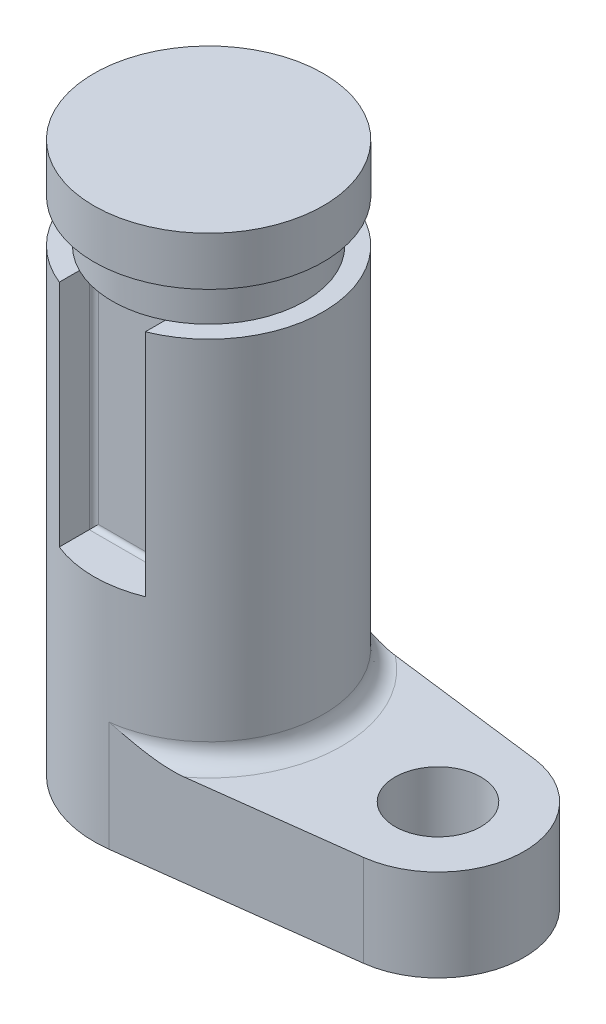
ISO-10303-21;
HEADER;
FILE_DESCRIPTION(('STEP AP214'),'2;1');
FILE_NAME('part.step','',(''),(''),'','','');
FILE_SCHEMA(('AUTOMOTIVE_DESIGN { 1 0 10303 214 1 1 1 1 }'));
ENDSEC;
DATA;
#1=APPLICATION_CONTEXT('core data for automotive mechanical design processes');
#2=APPLICATION_PROTOCOL_DEFINITION('international standard','automotive_design',2000,#1);
#3=PRODUCT_CONTEXT('',#1,'mechanical');
#4=PRODUCT('Part','Part','',(#3));
#5=PRODUCT_RELATED_PRODUCT_CATEGORY('part','',(#4));
#6=PRODUCT_DEFINITION_FORMATION('','',#4);
#7=PRODUCT_DEFINITION_CONTEXT('part definition',#1,'design');
#8=PRODUCT_DEFINITION('design','',#6,#7);
#9=PRODUCT_DEFINITION_SHAPE('','',#8);
#10=(LENGTH_UNIT() NAMED_UNIT(*) SI_UNIT(.MILLI.,.METRE.));
#11=(NAMED_UNIT(*) PLANE_ANGLE_UNIT() SI_UNIT($,.RADIAN.));
#12=(NAMED_UNIT(*) SI_UNIT($,.STERADIAN.) SOLID_ANGLE_UNIT());
#13=UNCERTAINTY_MEASURE_WITH_UNIT(LENGTH_MEASURE(1.E-05),#10,'distance_accuracy_value','');
#14=(GEOMETRIC_REPRESENTATION_CONTEXT(3) GLOBAL_UNCERTAINTY_ASSIGNED_CONTEXT((#13)) GLOBAL_UNIT_ASSIGNED_CONTEXT((#10,
#11,#12)) REPRESENTATION_CONTEXT('',''));
#15=CARTESIAN_POINT('',(0.,0.,0.));
#16=DIRECTION('',(0.,0.,1.));
#17=DIRECTION('',(1.,0.,0.));
#18=AXIS2_PLACEMENT_3D('',#15,#16,#17);
#19=CARTESIAN_POINT('',(0.,12.7,0.));
#20=DIRECTION('',(0.,-1.,0.));
#21=DIRECTION('',(0.,0.,-1.));
#22=AXIS2_PLACEMENT_3D('',#19,#20,#21);
#23=CYLINDRICAL_SURFACE('',#22,3.175);
#24=CARTESIAN_POINT('',(0.,0.508,0.));
#25=DIRECTION('',(0.,-1.,0.));
#26=DIRECTION('',(0.,0.,-1.));
#27=AXIS2_PLACEMENT_3D('',#24,#25,#26);
#28=CIRCLE('',#27,3.175);
#29=CARTESIAN_POINT('',(0.396875,0.508,3.15009765473628));
#30=VERTEX_POINT('',#29);
#31=CARTESIAN_POINT('',(0.396875,0.508,-3.15009765473628));
#32=VERTEX_POINT('',#31);
#33=EDGE_CURVE('E196',#30,#32,#28,.F.);
#34=ORIENTED_EDGE('',*,*,#33,.T.);
#35=DIRECTION('',(0.,1.,0.));
#36=VECTOR('',#35,1.);
#37=CARTESIAN_POINT('',(0.396875,-2.54,-3.15009765473628));
#38=LINE('',#37,#36);
#39=CARTESIAN_POINT('',(0.396875,-2.54,-3.15009765473628));
#40=VERTEX_POINT('',#39);
#41=EDGE_CURVE('E175',#40,#32,#38,.T.);
#42=ORIENTED_EDGE('',*,*,#41,.F.);
#43=CARTESIAN_POINT('',(0.,-2.54,0.));
#44=DIRECTION('',(0.,-1.,0.));
#45=DIRECTION('',(0.,0.,-1.));
#46=AXIS2_PLACEMENT_3D('',#43,#44,#45);
#47=CIRCLE('',#46,3.175);
#48=CARTESIAN_POINT('',(0.396875,-2.54,3.15009765473628));
#49=VERTEX_POINT('',#48);
#50=EDGE_CURVE('E173',#49,#40,#47,.T.);
#51=ORIENTED_EDGE('',*,*,#50,.F.);
#52=DIRECTION('',(0.,1.,0.));
#53=VECTOR('',#52,1.);
#54=CARTESIAN_POINT('',(0.396875,-2.54,3.15009765473628));
#55=LINE('',#54,#53);
#56=EDGE_CURVE('E186',#49,#30,#55,.T.);
#57=ORIENTED_EDGE('',*,*,#56,.T.);
#58=EDGE_LOOP('',(#34,#42,#51,#57));
#59=FACE_BOUND('',#58,.T.);
#60=CARTESIAN_POINT('',(0.,10.16,0.));
#61=DIRECTION('',(0.,1.,0.));
#62=DIRECTION('',(0.,0.,1.));
#63=AXIS2_PLACEMENT_3D('',#60,#61,#62);
#64=CIRCLE('',#63,3.175);
#65=CARTESIAN_POINT('',(1.190625,10.16,2.94330377456609));
#66=VERTEX_POINT('',#65);
#67=CARTESIAN_POINT('',(-1.190625,10.16,2.94330377456609));
#68=VERTEX_POINT('',#67);
#69=EDGE_CURVE('E153',#66,#68,#64,.T.);
#70=ORIENTED_EDGE('',*,*,#69,.F.);
#71=DIRECTION('',(0.,-1.,0.));
#72=VECTOR('',#71,1.);
#73=CARTESIAN_POINT('',(1.190625,12.7,2.94330377456609));
#74=LINE('',#73,#72);
#75=CARTESIAN_POINT('',(1.190625,3.81,2.94330377456609));
#76=VERTEX_POINT('',#75);
#77=EDGE_CURVE('E149',#76,#66,#74,.F.);
#78=ORIENTED_EDGE('',*,*,#77,.F.);
#79=CARTESIAN_POINT('',(0.,3.81,0.));
#80=DIRECTION('',(0.,-1.,0.));
#81=DIRECTION('',(0.,0.,-1.));
#82=AXIS2_PLACEMENT_3D('',#79,#80,#81);
#83=CIRCLE('',#82,3.175);
#84=CARTESIAN_POINT('',(-1.190625,3.81,2.94330377456609));
#85=VERTEX_POINT('',#84);
#86=EDGE_CURVE('E327',#76,#85,#83,.T.);
#87=ORIENTED_EDGE('',*,*,#86,.T.);
#88=DIRECTION('',(0.,-1.,0.));
#89=VECTOR('',#88,1.);
#90=CARTESIAN_POINT('',(-1.190625,12.7,2.94330377456609));
#91=LINE('',#90,#89);
#92=EDGE_CURVE('E329',#68,#85,#91,.T.);
#93=ORIENTED_EDGE('',*,*,#92,.F.);
#94=EDGE_LOOP('',(#70,#78,#87,#93));
#95=FACE_BOUND('',#94,.T.);
#96=ADVANCED_FACE('F38',(#59,#95),#23,.T.);
#97=CARTESIAN_POINT('',(0.,10.16,0.));
#98=DIRECTION('',(0.,-1.,0.));
#99=DIRECTION('',(0.,0.,-1.));
#100=AXIS2_PLACEMENT_3D('',#97,#98,#99);
#101=PLANE('',#100);
#102=CARTESIAN_POINT('',(0.,10.16,0.));
#103=DIRECTION('',(0.,-1.,0.));
#104=DIRECTION('',(0.,0.,-1.));
#105=AXIS2_PLACEMENT_3D('',#102,#103,#104);
#106=CIRCLE('',#105,2.667);
#107=CARTESIAN_POINT('',(-1.190625,10.16,2.38648300001802));
#108=VERTEX_POINT('',#107);
#109=CARTESIAN_POINT('',(1.190625,10.16,2.38648300001802));
#110=VERTEX_POINT('',#109);
#111=EDGE_CURVE('E12',#108,#110,#106,.F.);
#112=ORIENTED_EDGE('',*,*,#111,.F.);
#113=DIRECTION('',(0.,0.,1.));
#114=VECTOR('',#113,1.);
#115=CARTESIAN_POINT('',(-1.190625,10.16,4.36372));
#116=LINE('',#115,#114);
#117=CARTESIAN_POINT('',(-1.190625,10.16,2.11328));
#118=VERTEX_POINT('',#117);
#119=EDGE_CURVE('E150',#118,#108,#116,.T.);
#120=ORIENTED_EDGE('',*,*,#119,.F.);
#121=DIRECTION('',(-1.,0.,0.));
#122=VECTOR('',#121,1.);
#123=CARTESIAN_POINT('',(1.190625,10.16,2.11328));
#124=LINE('',#123,#122);
#125=CARTESIAN_POINT('',(1.190625,10.16,2.11328));
#126=VERTEX_POINT('',#125);
#127=EDGE_CURVE('E47',#118,#126,#124,.F.);
#128=ORIENTED_EDGE('',*,*,#127,.T.);
#129=DIRECTION('',(0.,0.,-1.));
#130=VECTOR('',#129,1.);
#131=CARTESIAN_POINT('',(1.190625,10.16,4.36372));
#132=LINE('',#131,#130);
#133=EDGE_CURVE('E141',#110,#126,#132,.T.);
#134=ORIENTED_EDGE('',*,*,#133,.F.);
#135=EDGE_LOOP('',(#112,#120,#128,#134));
#136=FACE_BOUND('',#135,.T.);
#137=ADVANCED_FACE('F142',(#136),#101,.T.);
#138=CARTESIAN_POINT('',(0.396875,-2.54,-3.15009765473628));
#139=DIRECTION('',(0.125,0.,-0.992156741649221));
#140=DIRECTION('',(-0.992156741649222,0.,-0.125));
#141=AXIS2_PLACEMENT_3D('',#138,#139,#140);
#142=PLANE('',#141);
#143=DIRECTION('',(-0.992156741649222,0.,-0.125));
#144=VECTOR('',#143,1.);
#145=CARTESIAN_POINT('',(0.396875,0.,-3.15009765473628));
#146=LINE('',#145,#144);
#147=CARTESIAN_POINT('',(6.64765625,0.,-2.36257324105221));
#148=VERTEX_POINT('',#147);
#149=CARTESIAN_POINT('',(2.24874665457004,0.,-2.91678375673618));
#150=VERTEX_POINT('',#149);
#151=EDGE_CURVE('E178',#148,#150,#146,.T.);
#152=ORIENTED_EDGE('',*,*,#151,.F.);
#153=DIRECTION('',(0.,1.,0.));
#154=VECTOR('',#153,1.);
#155=CARTESIAN_POINT('',(6.64765625,-2.54,-2.36257324105221));
#156=LINE('',#155,#154);
#157=CARTESIAN_POINT('',(6.64765625,-2.54,-2.36257324105221));
#158=VERTEX_POINT('',#157);
#159=EDGE_CURVE('E191',#158,#148,#156,.T.);
#160=ORIENTED_EDGE('',*,*,#159,.F.);
#161=DIRECTION('',(-0.992156741649222,0.,-0.125));
#162=VECTOR('',#161,1.);
#163=CARTESIAN_POINT('',(0.396875,-2.54,-3.15009765473628));
#164=LINE('',#163,#162);
#165=EDGE_CURVE('E163',#158,#40,#164,.T.);
#166=ORIENTED_EDGE('',*,*,#165,.T.);
#167=ORIENTED_EDGE('',*,*,#41,.T.);
#168=CARTESIAN_POINT('',(2.24874665457004,0.,-2.91678375673618));
#169=CARTESIAN_POINT('',(2.21231549692085,5.71728721498376E-06,-2.92137365117018));
#170=CARTESIAN_POINT('',(2.1758992098971,0.0010217288468089,-2.92596167208147));
#171=CARTESIAN_POINT('',(2.10317961007519,0.0048511736851646,-2.93512348048952));
#172=CARTESIAN_POINT('',(2.0668762431913,0.00766354336836755,-2.93969727480043));
#173=CARTESIAN_POINT('',(1.95839957562027,0.0184425634130269,-2.95336405029785));
#174=CARTESIAN_POINT('',(1.88645399557374,0.0287536847308182,-2.9624283413804));
#175=CARTESIAN_POINT('',(1.74411958427554,0.0541431163065835,-2.98036079163287));
#176=CARTESIAN_POINT('',(1.67372251439235,0.0691765666242499,-2.9892299887728));
#177=CARTESIAN_POINT('',(1.53378182393322,0.103023101549795,-3.00686085854677));
#178=CARTESIAN_POINT('',(1.46423892542614,0.121839177901396,-3.01562244020869));
#179=CARTESIAN_POINT('',(1.22704733837716,0.191369163494818,-3.04550577127576));
#180=CARTESIAN_POINT('',(1.06148442447233,0.249183267367251,-3.06636473777706));
#181=CARTESIAN_POINT('',(0.733022295383638,0.37256608848623,-3.10774707628523));
#182=CARTESIAN_POINT('',(0.570129927965552,0.438151996715697,-3.1282695855547));
#183=CARTESIAN_POINT('',(0.403795894832265,0.505209760541778,-3.14922570394693));
#184=CARTESIAN_POINT('',(0.400335450392073,0.506604880917865,-3.14966167896667));
#185=CARTESIAN_POINT('',(0.396875,0.508,-3.15009765473628));
#186=B_SPLINE_CURVE_WITH_KNOTS('',3,(#168,#169,#170,#171,#172,#173,#174,#175,#176,#177,#178,
#179,#180,#181,#182,#183,#184,#185),.UNSPECIFIED.,.F.,.F.,(4,2,2,2,2,2,2,2,4),(0.,
0.11012057214495,0.220176003983427,0.439667149666648,0.657133261980577,0.874772053488899,
1.40399836213705,1.93441795718018,1.94568738488306),.UNSPECIFIED.);
#187=EDGE_CURVE('E201',#32,#150,#186,.F.);
#188=ORIENTED_EDGE('',*,*,#187,.T.);
#189=EDGE_LOOP('',(#152,#160,#166,#167,#188));
#190=FACE_BOUND('',#189,.T.);
#191=ADVANCED_FACE('F214',(#190),#142,.T.);
#192=CARTESIAN_POINT('',(6.35,-2.54,0.));
#193=DIRECTION('',(0.,1.,0.));
#194=DIRECTION('',(0.,0.,1.));
#195=AXIS2_PLACEMENT_3D('',#192,#193,#194);
#196=CYLINDRICAL_SURFACE('',#195,2.38125);
#197=CARTESIAN_POINT('',(6.35,0.,0.));
#198=DIRECTION('',(0.,-1.,0.));
#199=DIRECTION('',(0.,0.,-1.));
#200=AXIS2_PLACEMENT_3D('',#197,#198,#199);
#201=CIRCLE('',#200,2.38125);
#202=CARTESIAN_POINT('',(6.64765625,0.,2.36257324105221));
#203=VERTEX_POINT('',#202);
#204=EDGE_CURVE('E181',#203,#148,#201,.F.);
#205=ORIENTED_EDGE('',*,*,#204,.F.);
#206=DIRECTION('',(0.,1.,0.));
#207=VECTOR('',#206,1.);
#208=CARTESIAN_POINT('',(6.64765625,-2.54,2.36257324105221));
#209=LINE('',#208,#207);
#210=CARTESIAN_POINT('',(6.64765625,-2.54,2.36257324105221));
#211=VERTEX_POINT('',#210);
#212=EDGE_CURVE('E188',#211,#203,#209,.T.);
#213=ORIENTED_EDGE('',*,*,#212,.F.);
#214=CARTESIAN_POINT('',(6.35,-2.54,0.));
#215=DIRECTION('',(0.,-1.,0.));
#216=DIRECTION('',(0.,0.,-1.));
#217=AXIS2_PLACEMENT_3D('',#214,#215,#216);
#218=CIRCLE('',#217,2.38125);
#219=EDGE_CURVE('E167',#211,#158,#218,.F.);
#220=ORIENTED_EDGE('',*,*,#219,.T.);
#221=ORIENTED_EDGE('',*,*,#159,.T.);
#222=EDGE_LOOP('',(#205,#213,#220,#221));
#223=FACE_BOUND('',#222,.T.);
#224=ADVANCED_FACE('F304',(#223),#196,.T.);
#225=CARTESIAN_POINT('',(0.396875,-2.54,3.15009765473628));
#226=DIRECTION('',(0.125,0.,0.992156741649221));
#227=DIRECTION('',(0.992156741649222,0.,-0.125));
#228=AXIS2_PLACEMENT_3D('',#225,#226,#227);
#229=PLANE('',#228);
#230=DIRECTION('',(0.992156741649222,0.,-0.125));
#231=VECTOR('',#230,1.);
#232=CARTESIAN_POINT('',(0.396875,0.,3.15009765473628));
#233=LINE('',#232,#231);
#234=CARTESIAN_POINT('',(2.24874665457004,0.,2.91678375673618));
#235=VERTEX_POINT('',#234);
#236=EDGE_CURVE('E164',#235,#203,#233,.T.);
#237=ORIENTED_EDGE('',*,*,#236,.F.);
#238=CARTESIAN_POINT('',(2.24874665457004,0.,2.91678375673618));
#239=CARTESIAN_POINT('',(2.21231549692085,5.71728721472642E-06,2.92137365117018));
#240=CARTESIAN_POINT('',(2.17589920989711,0.00102172884680827,2.92596167208147));
#241=CARTESIAN_POINT('',(2.10317961007522,0.0048511736851627,2.93512348048951));
#242=CARTESIAN_POINT('',(2.06687624319133,0.00766354336836473,2.93969727480042));
#243=CARTESIAN_POINT('',(1.95839957562032,0.0184425634130203,2.95336405029785));
#244=CARTESIAN_POINT('',(1.88645399557381,0.0287536847308077,2.96242834138039));
#245=CARTESIAN_POINT('',(1.7441195842756,0.0541431163065709,2.98036079163286));
#246=CARTESIAN_POINT('',(1.6737225143924,0.0691765666242408,2.98922998877279));
#247=CARTESIAN_POINT('',(1.53378182393324,0.103023101549786,3.00686085854677));
#248=CARTESIAN_POINT('',(1.46423892542614,0.121839177901384,3.01562244020869));
#249=CARTESIAN_POINT('',(1.22704733837716,0.19136916349484,3.04550577127576));
#250=CARTESIAN_POINT('',(1.06148442447237,0.24918326736738,3.06636473777706));
#251=CARTESIAN_POINT('',(0.733022295383581,0.372566088486109,3.10774707628524));
#252=CARTESIAN_POINT('',(0.57012992796536,0.43815199671522,3.12826958555472));
#253=CARTESIAN_POINT('',(0.403795894832259,0.505209760541757,3.14922570394694));
#254=CARTESIAN_POINT('',(0.40033545039207,0.506604880917854,3.14966167896667));
#255=CARTESIAN_POINT('',(0.396875,0.508,3.15009765473628));
#256=B_SPLINE_CURVE_WITH_KNOTS('',3,(#238,#239,#240,#241,#242,#243,#244,#245,#246,#247,#248,
#249,#250,#251,#252,#253,#254,#255),.UNSPECIFIED.,.F.,.F.,(4,2,2,2,2,2,2,2,4),(0.,
0.110120572144929,0.220176003983383,0.439667149666569,0.657133261980542,0.874772053488902,
1.40399836213706,1.93441795718018,1.94568738488306),.UNSPECIFIED.);
#257=EDGE_CURVE('E208',#235,#30,#256,.T.);
#258=ORIENTED_EDGE('',*,*,#257,.T.);
#259=ORIENTED_EDGE('',*,*,#56,.F.);
#260=DIRECTION('',(0.992156741649222,0.,-0.125));
#261=VECTOR('',#260,1.);
#262=CARTESIAN_POINT('',(0.396875,-2.54,3.15009765473628));
#263=LINE('',#262,#261);
#264=EDGE_CURVE('E170',#49,#211,#263,.T.);
#265=ORIENTED_EDGE('',*,*,#264,.T.);
#266=ORIENTED_EDGE('',*,*,#212,.T.);
#267=EDGE_LOOP('',(#237,#258,#259,#265,#266));
#268=FACE_BOUND('',#267,.T.);
#269=ADVANCED_FACE('F301',(#268),#229,.T.);
#270=CARTESIAN_POINT('',(6.35,-2.54,0.));
#271=DIRECTION('',(0.,1.,0.));
#272=DIRECTION('',(0.,0.,1.));
#273=AXIS2_PLACEMENT_3D('',#270,#271,#272);
#274=CYLINDRICAL_SURFACE('',#273,1.190625);
#275=CARTESIAN_POINT('',(6.35,-2.54,0.));
#276=DIRECTION('',(0.,-1.,0.));
#277=DIRECTION('',(0.,0.,-1.));
#278=AXIS2_PLACEMENT_3D('',#275,#276,#277);
#279=CIRCLE('',#278,1.190625);
#280=CARTESIAN_POINT('',(6.35,-2.54,-1.190625));
#281=VERTEX_POINT('',#280);
#282=EDGE_CURVE('E160',#281,#281,#279,.T.);
#283=ORIENTED_EDGE('',*,*,#282,.T.);
#284=EDGE_LOOP('',(#283));
#285=FACE_BOUND('',#284,.T.);
#286=CARTESIAN_POINT('',(6.35,0.,0.));
#287=DIRECTION('',(0.,-1.,0.));
#288=DIRECTION('',(0.,0.,-1.));
#289=AXIS2_PLACEMENT_3D('',#286,#287,#288);
#290=CIRCLE('',#289,1.190625);
#291=CARTESIAN_POINT('',(6.35,0.,-1.190625));
#292=VERTEX_POINT('',#291);
#293=EDGE_CURVE('E155',#292,#292,#290,.T.);
#294=ORIENTED_EDGE('',*,*,#293,.F.);
#295=EDGE_LOOP('',(#294));
#296=FACE_BOUND('',#295,.T.);
#297=ADVANCED_FACE('F297',(#285,#296),#274,.F.);
#298=CARTESIAN_POINT('',(0.,-2.54,0.));
#299=DIRECTION('',(0.,-1.,0.));
#300=DIRECTION('',(0.,0.,-1.));
#301=AXIS2_PLACEMENT_3D('',#298,#299,#300);
#302=PLANE('',#301);
#303=ORIENTED_EDGE('',*,*,#282,.F.);
#304=EDGE_LOOP('',(#303));
#305=FACE_BOUND('',#304,.T.);
#306=ORIENTED_EDGE('',*,*,#165,.F.);
#307=ORIENTED_EDGE('',*,*,#219,.F.);
#308=ORIENTED_EDGE('',*,*,#264,.F.);
#309=ORIENTED_EDGE('',*,*,#50,.T.);
#310=EDGE_LOOP('',(#306,#307,#308,#309));
#311=FACE_BOUND('',#310,.T.);
#312=ADVANCED_FACE('F294',(#305,#311),#302,.T.);
#313=CARTESIAN_POINT('',(0.,0.,0.));
#314=DIRECTION('',(0.,-1.,0.));
#315=DIRECTION('',(0.,0.,-1.));
#316=AXIS2_PLACEMENT_3D('',#313,#314,#315);
#317=PLANE('',#316);
#318=ORIENTED_EDGE('',*,*,#151,.T.);
#319=CARTESIAN_POINT('',(0.,0.,0.));
#320=DIRECTION('',(0.,-1.,0.));
#321=DIRECTION('',(0.,0.,-1.));
#322=AXIS2_PLACEMENT_3D('',#319,#320,#321);
#323=CIRCLE('',#322,3.683);
#324=EDGE_CURVE('E199',#150,#235,#323,.T.);
#325=ORIENTED_EDGE('',*,*,#324,.T.);
#326=ORIENTED_EDGE('',*,*,#236,.T.);
#327=ORIENTED_EDGE('',*,*,#204,.T.);
#328=EDGE_LOOP('',(#318,#325,#326,#327));
#329=FACE_BOUND('',#328,.T.);
#330=ORIENTED_EDGE('',*,*,#293,.T.);
#331=EDGE_LOOP('',(#330));
#332=FACE_BOUND('',#331,.T.);
#333=ADVANCED_FACE('F223',(#329,#332),#317,.F.);
#334=CARTESIAN_POINT('',(0.,0.508,0.));
#335=DIRECTION('',(0.,-1.,0.));
#336=DIRECTION('',(0.,0.,-1.));
#337=AXIS2_PLACEMENT_3D('',#334,#335,#336);
#338=TOROIDAL_SURFACE('',#337,3.683,0.508);
#339=ORIENTED_EDGE('',*,*,#257,.F.);
#340=ORIENTED_EDGE('',*,*,#324,.F.);
#341=ORIENTED_EDGE('',*,*,#187,.F.);
#342=ORIENTED_EDGE('',*,*,#33,.F.);
#343=EDGE_LOOP('',(#339,#340,#341,#342));
#344=FACE_BOUND('',#343,.T.);
#345=ADVANCED_FACE('F218',(#344),#338,.F.);
#346=CARTESIAN_POINT('',(1.190625,10.16,4.36372));
#347=DIRECTION('',(-1.,0.,0.));
#348=DIRECTION('',(0.,0.,1.));
#349=AXIS2_PLACEMENT_3D('',#346,#347,#348);
#350=PLANE('',#349);
#351=EDGE_CURVE('E134',#66,#110,#132,.T.);
#352=ORIENTED_EDGE('',*,*,#351,.T.);
#353=ORIENTED_EDGE('',*,*,#133,.T.);
#354=DIRECTION('',(0.,-1.,0.));
#355=VECTOR('',#354,1.);
#356=CARTESIAN_POINT('',(1.190625,3.81,2.11328));
#357=LINE('',#356,#355);
#358=CARTESIAN_POINT('',(1.190625,3.81,2.11328));
#359=VERTEX_POINT('',#358);
#360=EDGE_CURVE('E60',#126,#359,#357,.T.);
#361=ORIENTED_EDGE('',*,*,#360,.T.);
#362=DIRECTION('',(0.,0.,-1.));
#363=VECTOR('',#362,1.);
#364=CARTESIAN_POINT('',(1.190625,3.81,4.36372));
#365=LINE('',#364,#363);
#366=EDGE_CURVE('E156',#76,#359,#365,.T.);
#367=ORIENTED_EDGE('',*,*,#366,.F.);
#368=ORIENTED_EDGE('',*,*,#77,.T.);
#369=EDGE_LOOP('',(#352,#353,#361,#367,#368));
#370=FACE_BOUND('',#369,.T.);
#371=ADVANCED_FACE('F147',(#370),#350,.T.);
#372=CARTESIAN_POINT('',(-1.190625,10.16,4.36372));
#373=DIRECTION('',(1.,0.,0.));
#374=DIRECTION('',(0.,0.,-1.));
#375=AXIS2_PLACEMENT_3D('',#372,#373,#374);
#376=PLANE('',#375);
#377=DIRECTION('',(0.,0.,1.));
#378=VECTOR('',#377,1.);
#379=CARTESIAN_POINT('',(-1.190625,3.81,4.36372));
#380=LINE('',#379,#378);
#381=CARTESIAN_POINT('',(-1.190625,3.81,2.11328));
#382=VERTEX_POINT('',#381);
#383=EDGE_CURVE('E144',#382,#85,#380,.T.);
#384=ORIENTED_EDGE('',*,*,#383,.F.);
#385=DIRECTION('',(0.,-1.,0.));
#386=VECTOR('',#385,1.);
#387=CARTESIAN_POINT('',(-1.190625,10.16,2.11328));
#388=LINE('',#387,#386);
#389=EDGE_CURVE('E344',#382,#118,#388,.F.);
#390=ORIENTED_EDGE('',*,*,#389,.T.);
#391=ORIENTED_EDGE('',*,*,#119,.T.);
#392=EDGE_CURVE('E137',#108,#68,#116,.T.);
#393=ORIENTED_EDGE('',*,*,#392,.T.);
#394=ORIENTED_EDGE('',*,*,#92,.T.);
#395=EDGE_LOOP('',(#384,#390,#391,#393,#394));
#396=FACE_BOUND('',#395,.T.);
#397=ADVANCED_FACE('F284',(#396),#376,.T.);
#398=CARTESIAN_POINT('',(0.,3.81,0.));
#399=DIRECTION('',(0.,-1.,0.));
#400=DIRECTION('',(0.,0.,-1.));
#401=AXIS2_PLACEMENT_3D('',#398,#399,#400);
#402=PLANE('',#401);
#403=ORIENTED_EDGE('',*,*,#366,.T.);
#404=DIRECTION('',(-1.,0.,0.));
#405=VECTOR('',#404,1.);
#406=CARTESIAN_POINT('',(0.,3.81,2.11328));
#407=LINE('',#406,#405);
#408=EDGE_CURVE('E348',#359,#382,#407,.T.);
#409=ORIENTED_EDGE('',*,*,#408,.T.);
#410=ORIENTED_EDGE('',*,*,#383,.T.);
#411=ORIENTED_EDGE('',*,*,#86,.F.);
#412=EDGE_LOOP('',(#403,#409,#410,#411));
#413=FACE_BOUND('',#412,.T.);
#414=ADVANCED_FACE('F281',(#413),#402,.F.);
#415=CARTESIAN_POINT('',(-1.190625,10.16,1.98628));
#416=DIRECTION('',(0.,0.,1.));
#417=DIRECTION('',(1.,0.,0.));
#418=AXIS2_PLACEMENT_3D('',#415,#416,#417);
#419=PLANE('',#418);
#420=DIRECTION('',(0.,-1.,0.));
#421=VECTOR('',#420,1.);
#422=CARTESIAN_POINT('',(-1.063625,3.81,1.98628));
#423=LINE('',#422,#421);
#424=CARTESIAN_POINT('',(-1.063625,10.033,1.98628));
#425=VERTEX_POINT('',#424);
#426=CARTESIAN_POINT('',(-1.063625,3.937,1.98628));
#427=VERTEX_POINT('',#426);
#428=EDGE_CURVE('E339',#425,#427,#423,.T.);
#429=ORIENTED_EDGE('',*,*,#428,.T.);
#430=DIRECTION('',(-1.,0.,0.));
#431=VECTOR('',#430,1.);
#432=CARTESIAN_POINT('',(-1.190625,3.937,1.98628));
#433=LINE('',#432,#431);
#434=CARTESIAN_POINT('',(1.063625,3.937,1.98628));
#435=VERTEX_POINT('',#434);
#436=EDGE_CURVE('E342',#427,#435,#433,.F.);
#437=ORIENTED_EDGE('',*,*,#436,.T.);
#438=DIRECTION('',(0.,-1.,0.));
#439=VECTOR('',#438,1.);
#440=CARTESIAN_POINT('',(1.063625,10.16,1.98628));
#441=LINE('',#440,#439);
#442=CARTESIAN_POINT('',(1.063625,10.033,1.98628));
#443=VERTEX_POINT('',#442);
#444=EDGE_CURVE('E337',#435,#443,#441,.F.);
#445=ORIENTED_EDGE('',*,*,#444,.T.);
#446=DIRECTION('',(-1.,0.,0.));
#447=VECTOR('',#446,1.);
#448=CARTESIAN_POINT('',(-1.190625,10.033,1.98628));
#449=LINE('',#448,#447);
#450=EDGE_CURVE('E335',#443,#425,#449,.T.);
#451=ORIENTED_EDGE('',*,*,#450,.T.);
#452=EDGE_LOOP('',(#429,#437,#445,#451));
#453=FACE_BOUND('',#452,.T.);
#454=ADVANCED_FACE('F242',(#453),#419,.T.);
#455=CARTESIAN_POINT('',(1.063625,10.16,2.11328));
#456=DIRECTION('',(0.,1.,0.));
#457=DIRECTION('',(0.,0.,1.));
#458=AXIS2_PLACEMENT_3D('',#455,#456,#457);
#459=CYLINDRICAL_SURFACE('',#458,0.127);
#460=CARTESIAN_POINT('',(1.063625,3.937,2.11328));
#461=DIRECTION('',(0.707106781186547,0.707106781186547,0.));
#462=DIRECTION('',(-0.707106781186547,0.707106781186547,0.));
#463=AXIS2_PLACEMENT_3D('',#460,#461,#462);
#464=ELLIPSE('',#463,0.179605122421383,0.127);
#465=EDGE_CURVE('E352',#359,#435,#464,.T.);
#466=ORIENTED_EDGE('',*,*,#465,.F.);
#467=ORIENTED_EDGE('',*,*,#360,.F.);
#468=CARTESIAN_POINT('',(1.063625,10.033,2.11328));
#469=DIRECTION('',(-0.707106781186547,0.707106781186547,0.));
#470=DIRECTION('',(0.707106781186547,0.707106781186547,0.));
#471=AXIS2_PLACEMENT_3D('',#468,#469,#470);
#472=ELLIPSE('',#471,0.179605122421383,0.127);
#473=EDGE_CURVE('E158',#443,#126,#472,.F.);
#474=ORIENTED_EDGE('',*,*,#473,.F.);
#475=ORIENTED_EDGE('',*,*,#444,.F.);
#476=EDGE_LOOP('',(#466,#467,#474,#475));
#477=FACE_BOUND('',#476,.T.);
#478=ADVANCED_FACE('F40',(#477),#459,.F.);
#479=CARTESIAN_POINT('',(-1.190625,10.033,2.11328));
#480=DIRECTION('',(1.,0.,0.));
#481=DIRECTION('',(0.,0.,-1.));
#482=AXIS2_PLACEMENT_3D('',#479,#480,#481);
#483=CYLINDRICAL_SURFACE('',#482,0.127);
#484=ORIENTED_EDGE('',*,*,#473,.T.);
#485=ORIENTED_EDGE('',*,*,#127,.F.);
#486=CARTESIAN_POINT('',(-1.063625,10.033,2.11328));
#487=DIRECTION('',(0.707106781186547,0.707106781186547,0.));
#488=DIRECTION('',(-0.707106781186547,0.707106781186547,0.));
#489=AXIS2_PLACEMENT_3D('',#486,#487,#488);
#490=ELLIPSE('',#489,0.179605122421383,0.127);
#491=EDGE_CURVE('E265',#425,#118,#490,.T.);
#492=ORIENTED_EDGE('',*,*,#491,.F.);
#493=ORIENTED_EDGE('',*,*,#450,.F.);
#494=EDGE_LOOP('',(#484,#485,#492,#493));
#495=FACE_BOUND('',#494,.T.);
#496=ADVANCED_FACE('F235',(#495),#483,.F.);
#497=CARTESIAN_POINT('',(0.,3.937,2.11328));
#498=DIRECTION('',(-1.,0.,0.));
#499=DIRECTION('',(0.,0.,1.));
#500=AXIS2_PLACEMENT_3D('',#497,#498,#499);
#501=CYLINDRICAL_SURFACE('',#500,0.127);
#502=ORIENTED_EDGE('',*,*,#465,.T.);
#503=ORIENTED_EDGE('',*,*,#436,.F.);
#504=CARTESIAN_POINT('',(-1.063625,3.937,2.11328));
#505=DIRECTION('',(-0.707106781186547,0.707106781186547,0.));
#506=DIRECTION('',(0.707106781186547,0.707106781186547,0.));
#507=AXIS2_PLACEMENT_3D('',#504,#505,#506);
#508=ELLIPSE('',#507,0.179605122421383,0.127);
#509=EDGE_CURVE('E264',#382,#427,#508,.F.);
#510=ORIENTED_EDGE('',*,*,#509,.F.);
#511=ORIENTED_EDGE('',*,*,#408,.F.);
#512=EDGE_LOOP('',(#502,#503,#510,#511));
#513=FACE_BOUND('',#512,.T.);
#514=ADVANCED_FACE('F232',(#513),#501,.F.);
#515=CARTESIAN_POINT('',(-1.063625,10.16,2.11328));
#516=DIRECTION('',(0.,1.,0.));
#517=DIRECTION('',(0.,0.,1.));
#518=AXIS2_PLACEMENT_3D('',#515,#516,#517);
#519=CYLINDRICAL_SURFACE('',#518,0.127);
#520=ORIENTED_EDGE('',*,*,#491,.T.);
#521=ORIENTED_EDGE('',*,*,#389,.F.);
#522=ORIENTED_EDGE('',*,*,#509,.T.);
#523=ORIENTED_EDGE('',*,*,#428,.F.);
#524=EDGE_LOOP('',(#520,#521,#522,#523));
#525=FACE_BOUND('',#524,.T.);
#526=ADVANCED_FACE('F227',(#525),#519,.F.);
#527=CARTESIAN_POINT('',(2.778125,11.3538,0.));
#528=DIRECTION('',(0.,1.,0.));
#529=DIRECTION('',(0.,0.,1.));
#530=AXIS2_PLACEMENT_3D('',#527,#528,#529);
#531=PLANE('',#530);
#532=CARTESIAN_POINT('',(0.,11.3538,0.));
#533=DIRECTION('',(0.,1.,0.));
#534=DIRECTION('',(0.,0.,1.));
#535=AXIS2_PLACEMENT_3D('',#532,#533,#534);
#536=CIRCLE('',#535,2.667);
#537=CARTESIAN_POINT('',(0.,11.3538,2.667));
#538=VERTEX_POINT('',#537);
#539=EDGE_CURVE('E138',#538,#538,#536,.T.);
#540=ORIENTED_EDGE('',*,*,#539,.T.);
#541=EDGE_LOOP('',(#540));
#542=FACE_BOUND('',#541,.T.);
#543=CARTESIAN_POINT('',(0.,11.3538,0.));
#544=DIRECTION('',(0.,1.,0.));
#545=DIRECTION('',(0.,0.,1.));
#546=AXIS2_PLACEMENT_3D('',#543,#544,#545);
#547=CIRCLE('',#546,3.175);
#548=CARTESIAN_POINT('',(0.,11.3538,3.175));
#549=VERTEX_POINT('',#548);
#550=EDGE_CURVE('E42',#549,#549,#547,.T.);
#551=ORIENTED_EDGE('',*,*,#550,.F.);
#552=EDGE_LOOP('',(#551));
#553=FACE_BOUND('',#552,.T.);
#554=ADVANCED_FACE('F231',(#542,#553),#531,.F.);
#555=CARTESIAN_POINT('',(2.778125,10.16,0.));
#556=DIRECTION('',(0.,1.,0.));
#557=DIRECTION('',(0.,0.,1.));
#558=AXIS2_PLACEMENT_3D('',#555,#556,#557);
#559=PLANE('',#558);
#560=ORIENTED_EDGE('',*,*,#69,.T.);
#561=ORIENTED_EDGE('',*,*,#392,.F.);
#562=CARTESIAN_POINT('',(0.,10.16,0.));
#563=DIRECTION('',(0.,1.,0.));
#564=DIRECTION('',(0.,0.,1.));
#565=AXIS2_PLACEMENT_3D('',#562,#563,#564);
#566=CIRCLE('',#565,2.667);
#567=EDGE_CURVE('E52',#110,#108,#566,.T.);
#568=ORIENTED_EDGE('',*,*,#567,.F.);
#569=ORIENTED_EDGE('',*,*,#351,.F.);
#570=EDGE_LOOP('',(#560,#561,#568,#569));
#571=FACE_BOUND('',#570,.T.);
#572=ADVANCED_FACE('F132',(#571),#559,.T.);
#573=CARTESIAN_POINT('',(0.,11.3538,0.));
#574=DIRECTION('',(0.,-1.,0.));
#575=DIRECTION('',(0.,0.,-1.));
#576=AXIS2_PLACEMENT_3D('',#573,#574,#575);
#577=CYLINDRICAL_SURFACE('',#576,2.667);
#578=ORIENTED_EDGE('',*,*,#539,.F.);
#579=EDGE_LOOP('',(#578));
#580=FACE_BOUND('',#579,.T.);
#581=ORIENTED_EDGE('',*,*,#567,.T.);
#582=ORIENTED_EDGE('',*,*,#111,.T.);
#583=EDGE_LOOP('',(#581,#582));
#584=FACE_BOUND('',#583,.T.);
#585=ADVANCED_FACE('F126',(#580,#584),#577,.T.);
#586=CARTESIAN_POINT('',(0.,12.7,0.));
#587=DIRECTION('',(0.,1.,0.));
#588=DIRECTION('',(0.,0.,1.));
#589=AXIS2_PLACEMENT_3D('',#586,#587,#588);
#590=PLANE('',#589);
#591=CARTESIAN_POINT('',(0.,12.7,0.));
#592=DIRECTION('',(0.,1.,0.));
#593=DIRECTION('',(0.,0.,1.));
#594=AXIS2_PLACEMENT_3D('',#591,#592,#593);
#595=CIRCLE('',#594,3.175);
#596=CARTESIAN_POINT('',(0.,12.7,3.175));
#597=VERTEX_POINT('',#596);
#598=EDGE_CURVE('E193',#597,#597,#595,.T.);
#599=ORIENTED_EDGE('',*,*,#598,.T.);
#600=EDGE_LOOP('',(#599));
#601=FACE_BOUND('',#600,.T.);
#602=ADVANCED_FACE('F253',(#601),#590,.T.);
#603=ORIENTED_EDGE('',*,*,#550,.T.);
#604=EDGE_LOOP('',(#603));
#605=FACE_BOUND('',#604,.T.);
#606=ORIENTED_EDGE('',*,*,#598,.F.);
#607=EDGE_LOOP('',(#606));
#608=FACE_BOUND('',#607,.T.);
#609=ADVANCED_FACE('F225',(#605,#608),#23,.T.);
#610=CLOSED_SHELL('',(#96,#137,#191,#224,#269,#297,#312,#333,#345,#371,#397,#414,#454,#478,#496,
#514,#526,#554,#572,#585,#602,#609));
#611=MANIFOLD_SOLID_BREP('B2',#610);
#612=ADVANCED_BREP_SHAPE_REPRESENTATION('',(#18,#611),#14);
#613=SHAPE_DEFINITION_REPRESENTATION(#9,#612);
ENDSEC;
END-ISO-10303-21;
